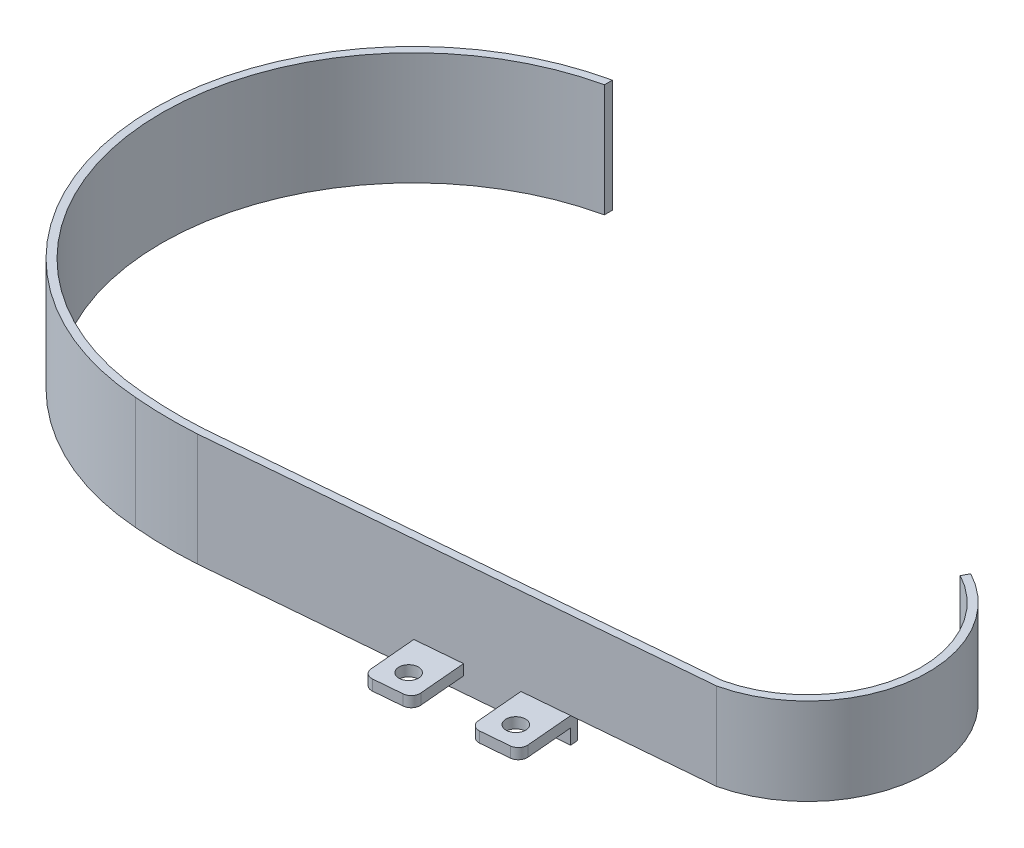
ISO-10303-21;
HEADER;
FILE_DESCRIPTION(('STEP AP214'),'2;1');
FILE_NAME('part.step','',(''),(''),'','','');
FILE_SCHEMA(('AUTOMOTIVE_DESIGN { 1 0 10303 214 1 1 1 1 }'));
ENDSEC;
DATA;
#1=APPLICATION_CONTEXT('core data for automotive mechanical design processes');
#2=APPLICATION_PROTOCOL_DEFINITION('international standard','automotive_design',2000,#1);
#3=PRODUCT_CONTEXT('',#1,'mechanical');
#4=PRODUCT('Part','Part','',(#3));
#5=PRODUCT_RELATED_PRODUCT_CATEGORY('part','',(#4));
#6=PRODUCT_DEFINITION_FORMATION('','',#4);
#7=PRODUCT_DEFINITION_CONTEXT('part definition',#1,'design');
#8=PRODUCT_DEFINITION('design','',#6,#7);
#9=PRODUCT_DEFINITION_SHAPE('','',#8);
#10=(LENGTH_UNIT() NAMED_UNIT(*) SI_UNIT(.MILLI.,.METRE.));
#11=(NAMED_UNIT(*) PLANE_ANGLE_UNIT() SI_UNIT($,.RADIAN.));
#12=(NAMED_UNIT(*) SI_UNIT($,.STERADIAN.) SOLID_ANGLE_UNIT());
#13=UNCERTAINTY_MEASURE_WITH_UNIT(LENGTH_MEASURE(1.E-05),#10,'distance_accuracy_value','');
#14=(GEOMETRIC_REPRESENTATION_CONTEXT(3) GLOBAL_UNCERTAINTY_ASSIGNED_CONTEXT((#13)) GLOBAL_UNIT_ASSIGNED_CONTEXT((#10,
#11,#12)) REPRESENTATION_CONTEXT('',''));
#15=CARTESIAN_POINT('',(0.,0.,0.));
#16=DIRECTION('',(0.,0.,1.));
#17=DIRECTION('',(1.,0.,0.));
#18=AXIS2_PLACEMENT_3D('',#15,#16,#17);
#19=CARTESIAN_POINT('',(187.443785094068,-22.3266,78.5446237632617));
#20=DIRECTION('',(-0.0861761294667495,0.,-0.996279917849462));
#21=DIRECTION('',(-0.996279917849462,0.,0.0861761294667495));
#22=AXIS2_PLACEMENT_3D('',#19,#20,#21);
#23=PLANE('',#22);
#24=DIRECTION('',(-0.996279917849461,0.,0.08617612946675));
#25=VECTOR('',#24,1.);
#26=CARTESIAN_POINT('',(139.197010709315,-13.1068000000013,82.7178688535654));
#27=LINE('',#26,#25);
#28=CARTESIAN_POINT('',(139.197010709315,-13.1068000000013,82.7178688535654));
#29=VERTEX_POINT('',#28);
#30=CARTESIAN_POINT('',(122.748429265621,-13.1068000000013,84.1406367510614));
#31=VERTEX_POINT('',#30);
#32=EDGE_CURVE('E236',#29,#31,#27,.T.);
#33=ORIENTED_EDGE('',*,*,#32,.F.);
#34=DIRECTION('',(0.996279917849462,0.,-0.0861761294667496));
#35=VECTOR('',#34,1.);
#36=CARTESIAN_POINT('',(8.1355101733642,-13.1068000000013,94.0544145732386));
#37=LINE('',#36,#35);
#38=CARTESIAN_POINT('',(187.443785094068,-13.1068000000013,78.5446237632617));
#39=VERTEX_POINT('',#38);
#40=EDGE_CURVE('E259',#29,#39,#37,.T.);
#41=ORIENTED_EDGE('',*,*,#40,.T.);
#42=DIRECTION('',(0.,1.,0.));
#43=VECTOR('',#42,1.);
#44=CARTESIAN_POINT('',(187.443785094068,-22.3266,78.5446237632617));
#45=LINE('',#44,#43);
#46=CARTESIAN_POINT('',(187.443785094068,18.161,78.5446237632617));
#47=VERTEX_POINT('',#46);
#48=EDGE_CURVE('E336',#39,#47,#45,.T.);
#49=ORIENTED_EDGE('',*,*,#48,.T.);
#50=DIRECTION('',(-0.996279917849462,0.,0.0861761294667495));
#51=VECTOR('',#50,1.);
#52=CARTESIAN_POINT('',(187.443785094068,18.161,78.5446237632617));
#53=LINE('',#52,#51);
#54=CARTESIAN_POINT('',(15.7338938107949,18.161,93.3971702783915));
#55=VERTEX_POINT('',#54);
#56=EDGE_CURVE('E299',#47,#55,#53,.T.);
#57=ORIENTED_EDGE('',*,*,#56,.T.);
#58=DIRECTION('',(0.,1.,0.));
#59=VECTOR('',#58,1.);
#60=CARTESIAN_POINT('',(15.7338938107949,-22.3266,93.3971702783915));
#61=LINE('',#60,#59);
#62=CARTESIAN_POINT('',(15.7338938107949,-22.3266,93.3971702783915));
#63=VERTEX_POINT('',#62);
#64=EDGE_CURVE('E338',#63,#55,#61,.T.);
#65=ORIENTED_EDGE('',*,*,#64,.F.);
#66=DIRECTION('',(-0.996279917849462,0.,0.0861761294667495));
#67=VECTOR('',#66,1.);
#68=CARTESIAN_POINT('',(187.443785094068,-22.3266,78.5446237632617));
#69=LINE('',#68,#67);
#70=CARTESIAN_POINT('',(139.197010709315,-22.3266,82.7178688535654));
#71=VERTEX_POINT('',#70);
#72=EDGE_CURVE('E326',#71,#63,#69,.T.);
#73=ORIENTED_EDGE('',*,*,#72,.F.);
#74=DIRECTION('',(0.,1.,0.));
#75=VECTOR('',#74,1.);
#76=CARTESIAN_POINT('',(139.197010709315,0.,82.7178688535654));
#77=LINE('',#76,#75);
#78=CARTESIAN_POINT('',(139.197010709315,-16.9168000000013,82.7178688535654));
#79=VERTEX_POINT('',#78);
#80=EDGE_CURVE('E262',#71,#79,#77,.T.);
#81=ORIENTED_EDGE('',*,*,#80,.T.);
#82=DIRECTION('',(0.996279917849461,0.,-0.08617612946675));
#83=VECTOR('',#82,1.);
#84=CARTESIAN_POINT('',(139.197010709315,-16.9168000000013,82.7178688535654));
#85=LINE('',#84,#83);
#86=CARTESIAN_POINT('',(122.748429265621,-16.9168000000013,84.1406367510614));
#87=VERTEX_POINT('',#86);
#88=EDGE_CURVE('E241',#87,#79,#85,.T.);
#89=ORIENTED_EDGE('',*,*,#88,.F.);
#90=DIRECTION('',(0.,-1.,0.));
#91=VECTOR('',#90,1.);
#92=CARTESIAN_POINT('',(122.748429265621,-13.1068000000013,84.1406367510615));
#93=LINE('',#92,#91);
#94=EDGE_CURVE('E247',#31,#87,#93,.T.);
#95=ORIENTED_EDGE('',*,*,#94,.F.);
#96=EDGE_LOOP('',(#33,#41,#49,#57,#65,#73,#81,#89,#95));
#97=FACE_BOUND('',#96,.T.);
#98=DIRECTION('',(0.,1.,0.));
#99=VECTOR('',#98,1.);
#100=CARTESIAN_POINT('',(103.769296830589,-13.1068000000013,85.7822920174031));
#101=LINE('',#100,#99);
#102=CARTESIAN_POINT('',(103.769296830589,-16.9168000000013,85.7822920174031));
#103=VERTEX_POINT('',#102);
#104=CARTESIAN_POINT('',(103.769296830588,-13.1068000000013,85.7822920174031));
#105=VERTEX_POINT('',#104);
#106=EDGE_CURVE('E201',#103,#105,#101,.T.);
#107=ORIENTED_EDGE('',*,*,#106,.F.);
#108=DIRECTION('',(0.996279917849462,0.,-0.0861761294667491));
#109=VECTOR('',#108,1.);
#110=CARTESIAN_POINT('',(103.769296830589,-16.9168000000013,85.7822920174031));
#111=LINE('',#110,#109);
#112=CARTESIAN_POINT('',(87.3207153868939,-16.9168000000013,87.2050599148991));
#113=VERTEX_POINT('',#112);
#114=EDGE_CURVE('E214',#113,#103,#111,.T.);
#115=ORIENTED_EDGE('',*,*,#114,.F.);
#116=DIRECTION('',(0.,-1.,0.));
#117=VECTOR('',#116,1.);
#118=CARTESIAN_POINT('',(87.3207153868939,-13.1068000000013,87.2050599148991));
#119=LINE('',#118,#117);
#120=CARTESIAN_POINT('',(87.3207153868939,-13.1068000000013,87.2050599148991));
#121=VERTEX_POINT('',#120);
#122=EDGE_CURVE('E224',#121,#113,#119,.T.);
#123=ORIENTED_EDGE('',*,*,#122,.F.);
#124=DIRECTION('',(-0.996279917849462,0.,0.0861761294667491));
#125=VECTOR('',#124,1.);
#126=CARTESIAN_POINT('',(103.769296830589,-13.1068000000013,85.7822920174031));
#127=LINE('',#126,#125);
#128=EDGE_CURVE('E217',#105,#121,#127,.T.);
#129=ORIENTED_EDGE('',*,*,#128,.F.);
#130=EDGE_LOOP('',(#107,#115,#123,#129));
#131=FACE_BOUND('',#130,.T.);
#132=ADVANCED_FACE('F37',(#97,#131),#23,.F.);
#133=CARTESIAN_POINT('',(186.839155598698,-22.3266,75.8167889277195));
#134=DIRECTION('',(-0.086176129466749,0.,-0.996279917849462));
#135=DIRECTION('',(-0.996279917849462,0.,0.086176129466749));
#136=AXIS2_PLACEMENT_3D('',#133,#134,#135);
#137=PLANE('',#136);
#138=DIRECTION('',(0.,1.,0.));
#139=VECTOR('',#138,1.);
#140=CARTESIAN_POINT('',(186.839155598698,-22.3266,75.8167889277195));
#141=LINE('',#140,#139);
#142=CARTESIAN_POINT('',(186.839155598698,-13.1068000000013,75.8167889277195));
#143=VERTEX_POINT('',#142);
#144=CARTESIAN_POINT('',(186.839155598698,18.161,75.8167889277195));
#145=VERTEX_POINT('',#144);
#146=EDGE_CURVE('E329',#143,#145,#141,.T.);
#147=ORIENTED_EDGE('',*,*,#146,.F.);
#148=DIRECTION('',(-0.996279917849462,0.,0.086176129466749));
#149=VECTOR('',#148,1.);
#150=CARTESIAN_POINT('',(186.839155598698,-13.1068000000013,75.8167889277195));
#151=LINE('',#150,#149);
#152=CARTESIAN_POINT('',(138.958320781565,-13.1068000000013,79.9583810106794));
#153=VERTEX_POINT('',#152);
#154=EDGE_CURVE('E278',#143,#153,#151,.T.);
#155=ORIENTED_EDGE('',*,*,#154,.T.);
#156=DIRECTION('',(0.,-1.,0.));
#157=VECTOR('',#156,1.);
#158=CARTESIAN_POINT('',(138.958320781565,-22.3266,79.9583810106794));
#159=LINE('',#158,#157);
#160=CARTESIAN_POINT('',(138.958320781565,-22.3266,79.9583810106794));
#161=VERTEX_POINT('',#160);
#162=EDGE_CURVE('E268',#153,#161,#159,.T.);
#163=ORIENTED_EDGE('',*,*,#162,.T.);
#164=DIRECTION('',(-0.996279917849462,0.,0.086176129466749));
#165=VECTOR('',#164,1.);
#166=CARTESIAN_POINT('',(186.839155598698,-22.3266,75.8167889277195));
#167=LINE('',#166,#165);
#168=CARTESIAN_POINT('',(15.7338938107949,-22.3266,90.6170362559049));
#169=VERTEX_POINT('',#168);
#170=EDGE_CURVE('E311',#161,#169,#167,.T.);
#171=ORIENTED_EDGE('',*,*,#170,.T.);
#172=DIRECTION('',(0.,1.,0.));
#173=VECTOR('',#172,1.);
#174=CARTESIAN_POINT('',(15.7338938107949,-22.3266,90.6170362559049));
#175=LINE('',#174,#173);
#176=CARTESIAN_POINT('',(15.7338938107949,18.161,90.6170362559049));
#177=VERTEX_POINT('',#176);
#178=EDGE_CURVE('E328',#169,#177,#175,.T.);
#179=ORIENTED_EDGE('',*,*,#178,.T.);
#180=DIRECTION('',(-0.996279917849462,0.,0.086176129466749));
#181=VECTOR('',#180,1.);
#182=CARTESIAN_POINT('',(186.839155598698,18.161,75.8167889277195));
#183=LINE('',#182,#181);
#184=EDGE_CURVE('E281',#145,#177,#183,.T.);
#185=ORIENTED_EDGE('',*,*,#184,.F.);
#186=EDGE_LOOP('',(#147,#155,#163,#171,#179,#185));
#187=FACE_BOUND('',#186,.T.);
#188=ADVANCED_FACE('F419',(#187),#137,.T.);
#189=CARTESIAN_POINT('',(177.83940901703,-22.3266,36.2514462962333));
#190=DIRECTION('',(0.,1.,0.));
#191=DIRECTION('',(0.,0.,1.));
#192=AXIS2_PLACEMENT_3D('',#189,#190,#191);
#193=CYLINDRICAL_SURFACE('',#192,40.576000001);
#194=CARTESIAN_POINT('',(177.83940901703,-13.1068000000013,36.2514462962333));
#195=DIRECTION('',(0.,-1.,0.));
#196=DIRECTION('',(1.,0.,0.));
#197=AXIS2_PLACEMENT_3D('',#194,#195,#196);
#198=CIRCLE('',#197,40.576000001);
#199=CARTESIAN_POINT('',(196.88940901703,-13.1068000000013,0.425348600822044));
#200=VERTEX_POINT('',#199);
#201=EDGE_CURVE('E276',#143,#200,#198,.F.);
#202=ORIENTED_EDGE('',*,*,#201,.F.);
#203=ORIENTED_EDGE('',*,*,#146,.T.);
#204=CARTESIAN_POINT('',(177.83940901703,18.161,36.2514462962333));
#205=DIRECTION('',(0.,1.,0.));
#206=DIRECTION('',(0.,0.,1.));
#207=AXIS2_PLACEMENT_3D('',#204,#205,#206);
#208=CIRCLE('',#207,40.576000001);
#209=CARTESIAN_POINT('',(196.88940901703,18.161,0.425348600822044));
#210=VERTEX_POINT('',#209);
#211=EDGE_CURVE('E308',#145,#210,#208,.T.);
#212=ORIENTED_EDGE('',*,*,#211,.T.);
#213=DIRECTION('',(0.,1.,0.));
#214=VECTOR('',#213,1.);
#215=CARTESIAN_POINT('',(196.88940901703,-22.3266,0.425348600822044));
#216=LINE('',#215,#214);
#217=EDGE_CURVE('E332',#200,#210,#216,.T.);
#218=ORIENTED_EDGE('',*,*,#217,.F.);
#219=EDGE_LOOP('',(#202,#203,#212,#218));
#220=FACE_BOUND('',#219,.T.);
#221=ADVANCED_FACE('F427',(#220),#193,.F.);
#222=CARTESIAN_POINT('',(196.88940901703,-22.3266,0.425348600822051));
#223=DIRECTION('',(0.882938133244488,0.,0.469489353300732));
#224=DIRECTION('',(0.469489353300732,0.,-0.882938133244488));
#225=AXIS2_PLACEMENT_3D('',#222,#223,#224);
#226=PLANE('',#225);
#227=DIRECTION('',(0.469489353300732,0.,-0.882938133244488));
#228=VECTOR('',#227,1.);
#229=CARTESIAN_POINT('',(196.88940901703,-13.1068000000013,0.425348600822051));
#230=LINE('',#229,#228);
#231=CARTESIAN_POINT('',(198.201162270152,-13.1068000000013,-2.04158054346305));
#232=VERTEX_POINT('',#231);
#233=EDGE_CURVE('E274',#200,#232,#230,.T.);
#234=ORIENTED_EDGE('',*,*,#233,.F.);
#235=ORIENTED_EDGE('',*,*,#217,.T.);
#236=DIRECTION('',(0.469489353300732,0.,-0.882938133244488));
#237=VECTOR('',#236,1.);
#238=CARTESIAN_POINT('',(196.88940901703,18.161,0.425348600822051));
#239=LINE('',#238,#237);
#240=CARTESIAN_POINT('',(198.201162270152,18.161,-2.04158054346305));
#241=VERTEX_POINT('',#240);
#242=EDGE_CURVE('E305',#210,#241,#239,.T.);
#243=ORIENTED_EDGE('',*,*,#242,.T.);
#244=DIRECTION('',(0.,1.,0.));
#245=VECTOR('',#244,1.);
#246=CARTESIAN_POINT('',(198.201162270152,-22.3266,-2.04158054346305));
#247=LINE('',#246,#245);
#248=EDGE_CURVE('E334',#232,#241,#247,.T.);
#249=ORIENTED_EDGE('',*,*,#248,.F.);
#250=EDGE_LOOP('',(#234,#235,#243,#249));
#251=FACE_BOUND('',#250,.T.);
#252=ADVANCED_FACE('F510',(#251),#226,.F.);
#253=CARTESIAN_POINT('',(177.83940901703,-22.3266,36.2514462962333));
#254=DIRECTION('',(0.,1.,0.));
#255=DIRECTION('',(0.,0.,1.));
#256=AXIS2_PLACEMENT_3D('',#253,#254,#255);
#257=CYLINDRICAL_SURFACE('',#256,43.370000001);
#258=ORIENTED_EDGE('',*,*,#48,.F.);
#259=CARTESIAN_POINT('',(177.83940901703,-13.1068000000013,36.2514462962333));
#260=DIRECTION('',(0.,-1.,0.));
#261=DIRECTION('',(1.,0.,0.));
#262=AXIS2_PLACEMENT_3D('',#259,#260,#261);
#263=CIRCLE('',#262,43.370000001);
#264=EDGE_CURVE('E271',#39,#232,#263,.F.);
#265=ORIENTED_EDGE('',*,*,#264,.T.);
#266=ORIENTED_EDGE('',*,*,#248,.T.);
#267=CARTESIAN_POINT('',(177.83940901703,18.161,36.2514462962333));
#268=DIRECTION('',(0.,1.,0.));
#269=DIRECTION('',(0.,0.,1.));
#270=AXIS2_PLACEMENT_3D('',#267,#268,#269);
#271=CIRCLE('',#270,43.370000001);
#272=EDGE_CURVE('E302',#47,#241,#271,.T.);
#273=ORIENTED_EDGE('',*,*,#272,.F.);
#274=EDGE_LOOP('',(#258,#265,#266,#273));
#275=FACE_BOUND('',#274,.T.);
#276=ADVANCED_FACE('F433',(#275),#257,.T.);
#277=CARTESIAN_POINT('',(6.27111389551688,-22.3266,-54.9196805978472));
#278=DIRECTION('',(0.,-1.,0.));
#279=DIRECTION('',(0.,0.,-1.));
#280=AXIS2_PLACEMENT_3D('',#277,#278,#279);
#281=PLANE('',#280);
#282=ORIENTED_EDGE('',*,*,#170,.F.);
#283=DIRECTION('',(0.0861761294667495,0.,0.996279917849462));
#284=VECTOR('',#283,1.);
#285=CARTESIAN_POINT('',(126.392912638676,-22.3266,-65.3099649896213));
#286=LINE('',#285,#284);
#287=EDGE_CURVE('E331',#161,#71,#286,.T.);
#288=ORIENTED_EDGE('',*,*,#287,.T.);
#289=ORIENTED_EDGE('',*,*,#72,.T.);
#290=CARTESIAN_POINT('',(6.13171110214794,-22.3266,-52.130415572278));
#291=DIRECTION('',(0.,-1.,0.));
#292=DIRECTION('',(0.,0.,-1.));
#293=AXIS2_PLACEMENT_3D('',#290,#291,#292);
#294=CIRCLE('',#293,145.844026810474);
#295=CARTESIAN_POINT('',(-6.85731477600897,-22.3266,93.1340513941167));
#296=VERTEX_POINT('',#295);
#297=EDGE_CURVE('E324',#63,#296,#294,.T.);
#298=ORIENTED_EDGE('',*,*,#297,.T.);
#299=CARTESIAN_POINT('',(5.51642065360625E-13,-22.3266,0.));
#300=DIRECTION('',(0.,-1.,0.));
#301=DIRECTION('',(0.,0.,-1.));
#302=AXIS2_PLACEMENT_3D('',#299,#300,#301);
#303=CIRCLE('',#302,93.3861568703801);
#304=CARTESIAN_POINT('',(-19.791883622163,-22.3266,-91.2647557258879));
#305=VERTEX_POINT('',#304);
#306=EDGE_CURVE('E322',#296,#305,#303,.T.);
#307=ORIENTED_EDGE('',*,*,#306,.T.);
#308=DIRECTION('',(0.,0.,-1.));
#309=VECTOR('',#308,1.);
#310=CARTESIAN_POINT('',(-19.7918836221629,-22.3266,-88.4037342486974));
#311=LINE('',#310,#309);
#312=CARTESIAN_POINT('',(-19.7918836221629,-22.3266,-88.4037342486974));
#313=VERTEX_POINT('',#312);
#314=EDGE_CURVE('E319',#313,#305,#311,.T.);
#315=ORIENTED_EDGE('',*,*,#314,.F.);
#316=CARTESIAN_POINT('',(0.,-22.3266,0.));
#317=DIRECTION('',(0.,-1.,0.));
#318=DIRECTION('',(0.,0.,-1.));
#319=AXIS2_PLACEMENT_3D('',#316,#317,#318);
#320=CIRCLE('',#319,90.5921568703801);
#321=CARTESIAN_POINT('',(-6.857314776009,-22.3266,90.3322540430066));
#322=VERTEX_POINT('',#321);
#323=EDGE_CURVE('E316',#322,#313,#320,.T.);
#324=ORIENTED_EDGE('',*,*,#323,.F.);
#325=CARTESIAN_POINT('',(6.27111389551688,-22.3266,-54.9196805978472));
#326=DIRECTION('',(0.,-1.,0.));
#327=DIRECTION('',(0.,0.,-1.));
#328=AXIS2_PLACEMENT_3D('',#325,#326,#327);
#329=CIRCLE('',#328,145.844026810474);
#330=EDGE_CURVE('E313',#169,#322,#329,.T.);
#331=ORIENTED_EDGE('',*,*,#330,.F.);
#332=EDGE_LOOP('',(#282,#288,#289,#298,#307,#315,#324,#331));
#333=FACE_BOUND('',#332,.T.);
#334=ADVANCED_FACE('F439',(#333),#281,.T.);
#335=CARTESIAN_POINT('',(6.13171110214794,-22.3266,-52.130415572278));
#336=DIRECTION('',(0.,1.,0.));
#337=DIRECTION('',(0.,0.,1.));
#338=AXIS2_PLACEMENT_3D('',#335,#336,#337);
#339=CYLINDRICAL_SURFACE('',#338,145.844026810474);
#340=ORIENTED_EDGE('',*,*,#64,.T.);
#341=CARTESIAN_POINT('',(6.13171110214794,18.161,-52.130415572278));
#342=DIRECTION('',(0.,-1.,0.));
#343=DIRECTION('',(0.,0.,-1.));
#344=AXIS2_PLACEMENT_3D('',#341,#342,#343);
#345=CIRCLE('',#344,145.844026810474);
#346=CARTESIAN_POINT('',(-6.85731477600897,18.161,93.1340513941167));
#347=VERTEX_POINT('',#346);
#348=EDGE_CURVE('E296',#55,#347,#345,.T.);
#349=ORIENTED_EDGE('',*,*,#348,.T.);
#350=DIRECTION('',(0.,1.,0.));
#351=VECTOR('',#350,1.);
#352=CARTESIAN_POINT('',(-6.85731477600897,-22.3266,93.1340513941167));
#353=LINE('',#352,#351);
#354=EDGE_CURVE('E340',#296,#347,#353,.T.);
#355=ORIENTED_EDGE('',*,*,#354,.F.);
#356=ORIENTED_EDGE('',*,*,#297,.F.);
#357=EDGE_LOOP('',(#340,#349,#355,#356));
#358=FACE_BOUND('',#357,.T.);
#359=ADVANCED_FACE('F435',(#358),#339,.T.);
#360=CARTESIAN_POINT('',(5.51642065360625E-13,-22.3266,0.));
#361=DIRECTION('',(0.,1.,0.));
#362=DIRECTION('',(0.,0.,1.));
#363=AXIS2_PLACEMENT_3D('',#360,#361,#362);
#364=CYLINDRICAL_SURFACE('',#363,93.3861568703801);
#365=ORIENTED_EDGE('',*,*,#354,.T.);
#366=CARTESIAN_POINT('',(5.51642065360625E-13,18.161,0.));
#367=DIRECTION('',(0.,-1.,0.));
#368=DIRECTION('',(0.,0.,-1.));
#369=AXIS2_PLACEMENT_3D('',#366,#367,#368);
#370=CIRCLE('',#369,93.3861568703801);
#371=CARTESIAN_POINT('',(-19.791883622163,18.161,-91.2647557258879));
#372=VERTEX_POINT('',#371);
#373=EDGE_CURVE('E293',#347,#372,#370,.T.);
#374=ORIENTED_EDGE('',*,*,#373,.T.);
#375=DIRECTION('',(0.,1.,0.));
#376=VECTOR('',#375,1.);
#377=CARTESIAN_POINT('',(-19.791883622163,-22.3266,-91.2647557258879));
#378=LINE('',#377,#376);
#379=EDGE_CURVE('E342',#305,#372,#378,.T.);
#380=ORIENTED_EDGE('',*,*,#379,.F.);
#381=ORIENTED_EDGE('',*,*,#306,.F.);
#382=EDGE_LOOP('',(#365,#374,#380,#381));
#383=FACE_BOUND('',#382,.T.);
#384=ADVANCED_FACE('F438',(#383),#364,.T.);
#385=CARTESIAN_POINT('',(-19.7918836221629,-22.3266,-88.4037342486974));
#386=DIRECTION('',(1.,0.,0.));
#387=DIRECTION('',(0.,0.,-1.));
#388=AXIS2_PLACEMENT_3D('',#385,#386,#387);
#389=PLANE('',#388);
#390=ORIENTED_EDGE('',*,*,#379,.T.);
#391=DIRECTION('',(0.,0.,-1.));
#392=VECTOR('',#391,1.);
#393=CARTESIAN_POINT('',(-19.7918836221629,18.161,-88.4037342486974));
#394=LINE('',#393,#392);
#395=CARTESIAN_POINT('',(-19.7918836221629,18.161,-88.4037342486974));
#396=VERTEX_POINT('',#395);
#397=EDGE_CURVE('E290',#396,#372,#394,.T.);
#398=ORIENTED_EDGE('',*,*,#397,.F.);
#399=DIRECTION('',(0.,1.,0.));
#400=VECTOR('',#399,1.);
#401=CARTESIAN_POINT('',(-19.7918836221629,-22.3266,-88.4037342486974));
#402=LINE('',#401,#400);
#403=EDGE_CURVE('E344',#313,#396,#402,.T.);
#404=ORIENTED_EDGE('',*,*,#403,.F.);
#405=ORIENTED_EDGE('',*,*,#314,.T.);
#406=EDGE_LOOP('',(#390,#398,#404,#405));
#407=FACE_BOUND('',#406,.T.);
#408=ADVANCED_FACE('F443',(#407),#389,.T.);
#409=CARTESIAN_POINT('',(0.,-22.3266,0.));
#410=DIRECTION('',(0.,1.,0.));
#411=DIRECTION('',(0.,0.,1.));
#412=AXIS2_PLACEMENT_3D('',#409,#410,#411);
#413=CYLINDRICAL_SURFACE('',#412,90.5921568703801);
#414=ORIENTED_EDGE('',*,*,#403,.T.);
#415=CARTESIAN_POINT('',(0.,18.161,0.));
#416=DIRECTION('',(0.,-1.,0.));
#417=DIRECTION('',(0.,0.,-1.));
#418=AXIS2_PLACEMENT_3D('',#415,#416,#417);
#419=CIRCLE('',#418,90.5921568703801);
#420=CARTESIAN_POINT('',(-6.857314776009,18.161,90.3322540430066));
#421=VERTEX_POINT('',#420);
#422=EDGE_CURVE('E287',#421,#396,#419,.T.);
#423=ORIENTED_EDGE('',*,*,#422,.F.);
#424=DIRECTION('',(0.,1.,0.));
#425=VECTOR('',#424,1.);
#426=CARTESIAN_POINT('',(-6.857314776009,-22.3266,90.3322540430066));
#427=LINE('',#426,#425);
#428=EDGE_CURVE('E346',#322,#421,#427,.T.);
#429=ORIENTED_EDGE('',*,*,#428,.F.);
#430=ORIENTED_EDGE('',*,*,#323,.T.);
#431=EDGE_LOOP('',(#414,#423,#429,#430));
#432=FACE_BOUND('',#431,.T.);
#433=ADVANCED_FACE('F447',(#432),#413,.F.);
#434=CARTESIAN_POINT('',(6.27111389551688,-22.3266,-54.9196805978472));
#435=DIRECTION('',(0.,1.,0.));
#436=DIRECTION('',(0.,0.,1.));
#437=AXIS2_PLACEMENT_3D('',#434,#435,#436);
#438=CYLINDRICAL_SURFACE('',#437,145.844026810474);
#439=ORIENTED_EDGE('',*,*,#428,.T.);
#440=CARTESIAN_POINT('',(6.27111389551688,18.161,-54.9196805978472));
#441=DIRECTION('',(0.,-1.,0.));
#442=DIRECTION('',(0.,0.,-1.));
#443=AXIS2_PLACEMENT_3D('',#440,#441,#442);
#444=CIRCLE('',#443,145.844026810474);
#445=EDGE_CURVE('E284',#177,#421,#444,.T.);
#446=ORIENTED_EDGE('',*,*,#445,.F.);
#447=ORIENTED_EDGE('',*,*,#178,.F.);
#448=ORIENTED_EDGE('',*,*,#330,.T.);
#449=EDGE_LOOP('',(#439,#446,#447,#448));
#450=FACE_BOUND('',#449,.T.);
#451=ADVANCED_FACE('F451',(#450),#438,.F.);
#452=CARTESIAN_POINT('',(6.27111389551688,18.161,-54.9196805978472));
#453=DIRECTION('',(0.,-1.,0.));
#454=DIRECTION('',(0.,0.,-1.));
#455=AXIS2_PLACEMENT_3D('',#452,#453,#454);
#456=PLANE('',#455);
#457=ORIENTED_EDGE('',*,*,#184,.T.);
#458=ORIENTED_EDGE('',*,*,#445,.T.);
#459=ORIENTED_EDGE('',*,*,#422,.T.);
#460=ORIENTED_EDGE('',*,*,#397,.T.);
#461=ORIENTED_EDGE('',*,*,#373,.F.);
#462=ORIENTED_EDGE('',*,*,#348,.F.);
#463=ORIENTED_EDGE('',*,*,#56,.F.);
#464=ORIENTED_EDGE('',*,*,#272,.T.);
#465=ORIENTED_EDGE('',*,*,#242,.F.);
#466=ORIENTED_EDGE('',*,*,#211,.F.);
#467=EDGE_LOOP('',(#457,#458,#459,#460,#461,#462,#463,#464,#465,#466));
#468=FACE_BOUND('',#467,.T.);
#469=ADVANCED_FACE('F454',(#468),#456,.F.);
#470=CARTESIAN_POINT('',(-8.52910152010724,-13.1068000000013,-98.6047135600447));
#471=DIRECTION('',(0.,-1.,0.));
#472=DIRECTION('',(1.,0.,0.));
#473=AXIS2_PLACEMENT_3D('',#470,#471,#472);
#474=PLANE('',#473);
#475=ORIENTED_EDGE('',*,*,#201,.T.);
#476=ORIENTED_EDGE('',*,*,#233,.T.);
#477=ORIENTED_EDGE('',*,*,#264,.F.);
#478=ORIENTED_EDGE('',*,*,#40,.F.);
#479=DIRECTION('',(0.0861761294667495,0.,0.996279917849462));
#480=VECTOR('',#479,1.);
#481=CARTESIAN_POINT('',(122.532399015844,-13.1068000000013,-109.941259279718));
#482=LINE('',#481,#480);
#483=EDGE_CURVE('E265',#153,#29,#482,.T.);
#484=ORIENTED_EDGE('',*,*,#483,.F.);
#485=ORIENTED_EDGE('',*,*,#154,.F.);
#486=EDGE_LOOP('',(#475,#476,#477,#478,#484,#485));
#487=FACE_BOUND('',#486,.T.);
#488=ADVANCED_FACE('F506',(#487),#474,.T.);
#489=CARTESIAN_POINT('',(122.532399015844,0.,-109.941259279718));
#490=DIRECTION('',(0.996279917849462,0.,-0.0861761294667495));
#491=DIRECTION('',(-0.0861761294667495,0.,-0.996279917849462));
#492=AXIS2_PLACEMENT_3D('',#489,#490,#491);
#493=PLANE('',#492);
#494=DIRECTION('',(-0.0861761294667495,0.,-0.996279917849462));
#495=VECTOR('',#494,1.);
#496=CARTESIAN_POINT('',(140.926220923195,-13.1068000000013,102.709221685133));
#497=LINE('',#496,#495);
#498=CARTESIAN_POINT('',(140.652611712138,-13.1068000000013,99.5460329459607));
#499=VERTEX_POINT('',#498);
#500=EDGE_CURVE('E257',#499,#29,#497,.T.);
#501=ORIENTED_EDGE('',*,*,#500,.F.);
#502=DIRECTION('',(0.,1.,0.));
#503=VECTOR('',#502,1.);
#504=CARTESIAN_POINT('',(140.652611712138,-16.9168000000013,99.5460329459607));
#505=LINE('',#504,#503);
#506=CARTESIAN_POINT('',(140.652611712138,-16.9168000000013,99.5460329459607));
#507=VERTEX_POINT('',#506);
#508=EDGE_CURVE('E62',#499,#507,#505,.F.);
#509=ORIENTED_EDGE('',*,*,#508,.T.);
#510=DIRECTION('',(-0.0861761294667495,0.,-0.996279917849462));
#511=VECTOR('',#510,1.);
#512=CARTESIAN_POINT('',(140.926220923195,-16.9168000000013,102.709221685133));
#513=LINE('',#512,#511);
#514=EDGE_CURVE('E244',#507,#79,#513,.T.);
#515=ORIENTED_EDGE('',*,*,#514,.T.);
#516=ORIENTED_EDGE('',*,*,#80,.F.);
#517=ORIENTED_EDGE('',*,*,#287,.F.);
#518=ORIENTED_EDGE('',*,*,#162,.F.);
#519=ORIENTED_EDGE('',*,*,#483,.T.);
#520=EDGE_LOOP('',(#501,#509,#515,#516,#517,#518,#519));
#521=FACE_BOUND('',#520,.T.);
#522=ADVANCED_FACE('F488',(#521),#493,.T.);
#523=CARTESIAN_POINT('',(140.926220923195,-13.1068000000013,102.709221685133));
#524=DIRECTION('',(0.,-1.,0.));
#525=DIRECTION('',(0.,0.,-1.));
#526=AXIS2_PLACEMENT_3D('',#523,#524,#525);
#527=PLANE('',#526);
#528=CARTESIAN_POINT('',(132.13436634208,-13.1068000000013,95.3852891330088));
#529=DIRECTION('',(0.,-1.,0.));
#530=DIRECTION('',(0.,0.,-1.));
#531=AXIS2_PLACEMENT_3D('',#528,#529,#530);
#532=CIRCLE('',#531,3.50000000000002);
#533=CARTESIAN_POINT('',(132.13436634208,-13.1068000000013,91.8852891330088));
#534=VERTEX_POINT('',#533);
#535=EDGE_CURVE('E218',#534,#534,#532,.T.);
#536=ORIENTED_EDGE('',*,*,#535,.T.);
#537=EDGE_LOOP('',(#536));
#538=FACE_BOUND('',#537,.T.);
#539=DIRECTION('',(-0.996279917849461,0.,0.08617612946675));
#540=VECTOR('',#539,1.);
#541=CARTESIAN_POINT('',(140.926220923195,-13.1068000000013,102.709221685133));
#542=LINE('',#541,#540);
#543=CARTESIAN_POINT('',(137.763032184023,-13.1068000000013,102.98283089619));
#544=VERTEX_POINT('',#543);
#545=CARTESIAN_POINT('',(127.640828218673,-13.1068000000013,103.858380371572));
#546=VERTEX_POINT('',#545);
#547=EDGE_CURVE('E237',#544,#546,#542,.T.);
#548=ORIENTED_EDGE('',*,*,#547,.F.);
#549=CARTESIAN_POINT('',(137.489422972966,-13.1068000000013,99.8196421570177));
#550=DIRECTION('',(0.,-1.,0.));
#551=DIRECTION('',(0.,0.,-1.));
#552=AXIS2_PLACEMENT_3D('',#549,#550,#551);
#553=CIRCLE('',#552,3.175);
#554=EDGE_CURVE('E376',#544,#499,#553,.F.);
#555=ORIENTED_EDGE('',*,*,#554,.T.);
#556=ORIENTED_EDGE('',*,*,#500,.T.);
#557=ORIENTED_EDGE('',*,*,#32,.T.);
#558=DIRECTION('',(-0.0861761294667495,0.,-0.996279917849462));
#559=VECTOR('',#558,1.);
#560=CARTESIAN_POINT('',(124.477639479501,-13.1068000000013,104.131989582629));
#561=LINE('',#560,#559);
#562=CARTESIAN_POINT('',(124.204030268444,-13.1068000000013,100.968800843457));
#563=VERTEX_POINT('',#562);
#564=EDGE_CURVE('E255',#563,#31,#561,.T.);
#565=ORIENTED_EDGE('',*,*,#564,.F.);
#566=CARTESIAN_POINT('',(127.367219007616,-13.1068000000013,100.6951916324));
#567=DIRECTION('',(0.,-1.,0.));
#568=DIRECTION('',(0.,0.,-1.));
#569=AXIS2_PLACEMENT_3D('',#566,#567,#568);
#570=CIRCLE('',#569,3.175);
#571=EDGE_CURVE('E374',#563,#546,#570,.F.);
#572=ORIENTED_EDGE('',*,*,#571,.T.);
#573=EDGE_LOOP('',(#548,#555,#556,#557,#565,#572));
#574=FACE_BOUND('',#573,.T.);
#575=ADVANCED_FACE('F482',(#538,#574),#527,.F.);
#576=CARTESIAN_POINT('',(124.477639479501,-13.1068000000013,104.131989582629));
#577=DIRECTION('',(0.996279917849462,0.,-0.0861761294667495));
#578=DIRECTION('',(-0.0861761294667495,0.,-0.996279917849462));
#579=AXIS2_PLACEMENT_3D('',#576,#577,#578);
#580=PLANE('',#579);
#581=DIRECTION('',(-0.0861761294667495,0.,-0.996279917849462));
#582=VECTOR('',#581,1.);
#583=CARTESIAN_POINT('',(124.477639479501,-16.9168000000013,104.131989582629));
#584=LINE('',#583,#582);
#585=CARTESIAN_POINT('',(124.204030268444,-16.9168000000013,100.968800843457));
#586=VERTEX_POINT('',#585);
#587=EDGE_CURVE('E253',#586,#87,#584,.T.);
#588=ORIENTED_EDGE('',*,*,#587,.F.);
#589=DIRECTION('',(0.,-1.,0.));
#590=VECTOR('',#589,1.);
#591=CARTESIAN_POINT('',(124.204030268444,-13.1068000000013,100.968800843457));
#592=LINE('',#591,#590);
#593=EDGE_CURVE('E11',#586,#563,#592,.F.);
#594=ORIENTED_EDGE('',*,*,#593,.T.);
#595=ORIENTED_EDGE('',*,*,#564,.T.);
#596=ORIENTED_EDGE('',*,*,#94,.T.);
#597=EDGE_LOOP('',(#588,#594,#595,#596));
#598=FACE_BOUND('',#597,.T.);
#599=ADVANCED_FACE('F479',(#598),#580,.F.);
#600=CARTESIAN_POINT('',(140.926220923195,-16.9168000000013,102.709221685133));
#601=DIRECTION('',(0.,1.,0.));
#602=DIRECTION('',(-1.,0.,0.));
#603=AXIS2_PLACEMENT_3D('',#600,#601,#602);
#604=PLANE('',#603);
#605=CARTESIAN_POINT('',(132.13436634208,-16.9168000000013,95.3852891330088));
#606=DIRECTION('',(0.,1.,0.));
#607=DIRECTION('',(-1.,0.,0.));
#608=AXIS2_PLACEMENT_3D('',#605,#606,#607);
#609=CIRCLE('',#608,3.50000000000002);
#610=CARTESIAN_POINT('',(128.63436634208,-16.9168000000013,95.3852891330088));
#611=VERTEX_POINT('',#610);
#612=EDGE_CURVE('E41',#611,#611,#609,.T.);
#613=ORIENTED_EDGE('',*,*,#612,.T.);
#614=EDGE_LOOP('',(#613));
#615=FACE_BOUND('',#614,.T.);
#616=ORIENTED_EDGE('',*,*,#514,.F.);
#617=CARTESIAN_POINT('',(137.489422972966,-16.9168000000013,99.8196421570177));
#618=DIRECTION('',(0.,1.,0.));
#619=DIRECTION('',(-1.,0.,0.));
#620=AXIS2_PLACEMENT_3D('',#617,#618,#619);
#621=CIRCLE('',#620,3.175);
#622=CARTESIAN_POINT('',(137.763032184023,-16.9168000000013,102.98283089619));
#623=VERTEX_POINT('',#622);
#624=EDGE_CURVE('E46',#507,#623,#621,.F.);
#625=ORIENTED_EDGE('',*,*,#624,.T.);
#626=DIRECTION('',(0.996279917849461,0.,-0.08617612946675));
#627=VECTOR('',#626,1.);
#628=CARTESIAN_POINT('',(140.926220923195,-16.9168000000013,102.709221685133));
#629=LINE('',#628,#627);
#630=CARTESIAN_POINT('',(127.640828218673,-16.9168000000013,103.858380371572));
#631=VERTEX_POINT('',#630);
#632=EDGE_CURVE('E240',#631,#623,#629,.T.);
#633=ORIENTED_EDGE('',*,*,#632,.F.);
#634=CARTESIAN_POINT('',(127.367219007616,-16.9168000000013,100.6951916324));
#635=DIRECTION('',(0.,1.,0.));
#636=DIRECTION('',(-1.,0.,0.));
#637=AXIS2_PLACEMENT_3D('',#634,#635,#636);
#638=CIRCLE('',#637,3.175);
#639=EDGE_CURVE('E54',#631,#586,#638,.F.);
#640=ORIENTED_EDGE('',*,*,#639,.T.);
#641=ORIENTED_EDGE('',*,*,#587,.T.);
#642=ORIENTED_EDGE('',*,*,#88,.T.);
#643=EDGE_LOOP('',(#616,#625,#633,#640,#641,#642));
#644=FACE_BOUND('',#643,.T.);
#645=ADVANCED_FACE('F470',(#615,#644),#604,.F.);
#646=CARTESIAN_POINT('',(9.86472038724404,0.,114.045767404806));
#647=DIRECTION('',(-0.08617612946675,0.,-0.996279917849462));
#648=DIRECTION('',(-0.996279917849462,0.,0.08617612946675));
#649=AXIS2_PLACEMENT_3D('',#646,#647,#648);
#650=PLANE('',#649);
#651=ORIENTED_EDGE('',*,*,#632,.T.);
#652=DIRECTION('',(0.,1.,0.));
#653=VECTOR('',#652,1.);
#654=CARTESIAN_POINT('',(137.763032184023,-13.1068000000013,102.98283089619));
#655=LINE('',#654,#653);
#656=EDGE_CURVE('E371',#623,#544,#655,.T.);
#657=ORIENTED_EDGE('',*,*,#656,.T.);
#658=ORIENTED_EDGE('',*,*,#547,.T.);
#659=DIRECTION('',(0.,-1.,0.));
#660=VECTOR('',#659,1.);
#661=CARTESIAN_POINT('',(127.640828218673,0.,103.858380371572));
#662=LINE('',#661,#660);
#663=EDGE_CURVE('E368',#546,#631,#662,.T.);
#664=ORIENTED_EDGE('',*,*,#663,.T.);
#665=EDGE_LOOP('',(#651,#657,#658,#664));
#666=FACE_BOUND('',#665,.T.);
#667=ADVANCED_FACE('F472',(#666),#650,.F.);
#668=CARTESIAN_POINT('',(105.498507044468,-13.1068000000013,105.77364484897));
#669=DIRECTION('',(-0.996279917849462,0.,0.0861761294667495));
#670=DIRECTION('',(0.0861761294667495,0.,0.996279917849462));
#671=AXIS2_PLACEMENT_3D('',#668,#669,#670);
#672=PLANE('',#671);
#673=DIRECTION('',(-0.0861761294667495,0.,-0.996279917849462));
#674=VECTOR('',#673,1.);
#675=CARTESIAN_POINT('',(105.498507044468,-13.1068000000013,105.77364484897));
#676=LINE('',#675,#674);
#677=CARTESIAN_POINT('',(105.224897833411,-13.1068000000013,102.610456109798));
#678=VERTEX_POINT('',#677);
#679=EDGE_CURVE('E234',#678,#105,#676,.T.);
#680=ORIENTED_EDGE('',*,*,#679,.F.);
#681=DIRECTION('',(0.,1.,0.));
#682=VECTOR('',#681,1.);
#683=CARTESIAN_POINT('',(105.224897833411,-13.1068000000013,102.610456109798));
#684=LINE('',#683,#682);
#685=CARTESIAN_POINT('',(105.224897833411,-16.9168000000013,102.610456109798));
#686=VERTEX_POINT('',#685);
#687=EDGE_CURVE('E203',#678,#686,#684,.F.);
#688=ORIENTED_EDGE('',*,*,#687,.T.);
#689=DIRECTION('',(-0.0861761294667495,0.,-0.996279917849462));
#690=VECTOR('',#689,1.);
#691=CARTESIAN_POINT('',(105.498507044468,-16.9168000000013,105.77364484897));
#692=LINE('',#691,#690);
#693=EDGE_CURVE('E197',#686,#103,#692,.T.);
#694=ORIENTED_EDGE('',*,*,#693,.T.);
#695=ORIENTED_EDGE('',*,*,#106,.T.);
#696=EDGE_LOOP('',(#680,#688,#694,#695));
#697=FACE_BOUND('',#696,.T.);
#698=ADVANCED_FACE('F200',(#697),#672,.F.);
#699=CARTESIAN_POINT('',(105.498507044468,-13.1068000000013,105.77364484897));
#700=DIRECTION('',(0.,-1.,0.));
#701=DIRECTION('',(0.,0.,-1.));
#702=AXIS2_PLACEMENT_3D('',#699,#700,#701);
#703=PLANE('',#702);
#704=CARTESIAN_POINT('',(96.7066524633533,-13.1068000000013,98.4497122968464));
#705=DIRECTION('',(0.,-1.,0.));
#706=DIRECTION('',(0.,0.,-1.));
#707=AXIS2_PLACEMENT_3D('',#704,#705,#706);
#708=CIRCLE('',#707,3.49999999999999);
#709=CARTESIAN_POINT('',(96.7066524633533,-13.1068000000013,94.9497122968464));
#710=VERTEX_POINT('',#709);
#711=EDGE_CURVE('E382',#710,#710,#708,.T.);
#712=ORIENTED_EDGE('',*,*,#711,.T.);
#713=EDGE_LOOP('',(#712));
#714=FACE_BOUND('',#713,.T.);
#715=DIRECTION('',(-0.0861761294667495,0.,-0.996279917849462));
#716=VECTOR('',#715,1.);
#717=CARTESIAN_POINT('',(89.0499256007737,-13.1068000000013,107.196412746466));
#718=LINE('',#717,#716);
#719=CARTESIAN_POINT('',(88.7763163897168,-13.1068000000013,104.033224007294));
#720=VERTEX_POINT('',#719);
#721=EDGE_CURVE('E232',#720,#121,#718,.T.);
#722=ORIENTED_EDGE('',*,*,#721,.F.);
#723=CARTESIAN_POINT('',(91.9395051288888,-13.1068000000013,103.759614796237));
#724=DIRECTION('',(0.,-1.,0.));
#725=DIRECTION('',(0.,0.,-1.));
#726=AXIS2_PLACEMENT_3D('',#723,#724,#725);
#727=CIRCLE('',#726,3.175);
#728=CARTESIAN_POINT('',(92.2131143399457,-13.1068000000013,106.922803535409));
#729=VERTEX_POINT('',#728);
#730=EDGE_CURVE('E365',#720,#729,#727,.F.);
#731=ORIENTED_EDGE('',*,*,#730,.T.);
#732=DIRECTION('',(-0.996279917849462,0.,0.0861761294667491));
#733=VECTOR('',#732,1.);
#734=CARTESIAN_POINT('',(105.498507044468,-13.1068000000013,105.77364484897));
#735=LINE('',#734,#733);
#736=CARTESIAN_POINT('',(102.335318305296,-13.1068000000013,106.047254060027));
#737=VERTEX_POINT('',#736);
#738=EDGE_CURVE('E223',#737,#729,#735,.T.);
#739=ORIENTED_EDGE('',*,*,#738,.F.);
#740=CARTESIAN_POINT('',(102.061709094239,-13.1068000000013,102.884065320855));
#741=DIRECTION('',(0.,-1.,0.));
#742=DIRECTION('',(0.,0.,-1.));
#743=AXIS2_PLACEMENT_3D('',#740,#741,#742);
#744=CIRCLE('',#743,3.175);
#745=EDGE_CURVE('E363',#737,#678,#744,.F.);
#746=ORIENTED_EDGE('',*,*,#745,.T.);
#747=ORIENTED_EDGE('',*,*,#679,.T.);
#748=ORIENTED_EDGE('',*,*,#128,.T.);
#749=EDGE_LOOP('',(#722,#731,#739,#746,#747,#748));
#750=FACE_BOUND('',#749,.T.);
#751=ADVANCED_FACE('F396',(#714,#750),#703,.F.);
#752=CARTESIAN_POINT('',(89.0499256007737,-13.1068000000013,107.196412746466));
#753=DIRECTION('',(0.996279917849462,0.,-0.0861761294667495));
#754=DIRECTION('',(-0.0861761294667495,0.,-0.996279917849462));
#755=AXIS2_PLACEMENT_3D('',#752,#753,#754);
#756=PLANE('',#755);
#757=DIRECTION('',(-0.0861761294667495,0.,-0.996279917849462));
#758=VECTOR('',#757,1.);
#759=CARTESIAN_POINT('',(89.0499256007737,-16.9168000000013,107.196412746466));
#760=LINE('',#759,#758);
#761=CARTESIAN_POINT('',(88.7763163897168,-16.9168000000013,104.033224007294));
#762=VERTEX_POINT('',#761);
#763=EDGE_CURVE('E207',#762,#113,#760,.T.);
#764=ORIENTED_EDGE('',*,*,#763,.F.);
#765=DIRECTION('',(0.,-1.,0.));
#766=VECTOR('',#765,1.);
#767=CARTESIAN_POINT('',(88.7763163897168,-13.1068000000013,104.033224007294));
#768=LINE('',#767,#766);
#769=EDGE_CURVE('E361',#762,#720,#768,.F.);
#770=ORIENTED_EDGE('',*,*,#769,.T.);
#771=ORIENTED_EDGE('',*,*,#721,.T.);
#772=ORIENTED_EDGE('',*,*,#122,.T.);
#773=EDGE_LOOP('',(#764,#770,#771,#772));
#774=FACE_BOUND('',#773,.T.);
#775=ADVANCED_FACE('F409',(#774),#756,.F.);
#776=CARTESIAN_POINT('',(105.498507044468,-16.9168000000013,105.77364484897));
#777=DIRECTION('',(0.,1.,0.));
#778=DIRECTION('',(0.,0.,1.));
#779=AXIS2_PLACEMENT_3D('',#776,#777,#778);
#780=PLANE('',#779);
#781=CARTESIAN_POINT('',(96.7066524633533,-16.9168000000013,98.4497122968464));
#782=DIRECTION('',(0.,1.,0.));
#783=DIRECTION('',(0.,0.,1.));
#784=AXIS2_PLACEMENT_3D('',#781,#782,#783);
#785=CIRCLE('',#784,3.49999999999999);
#786=CARTESIAN_POINT('',(96.7066524633533,-16.9168000000013,101.949712296846));
#787=VERTEX_POINT('',#786);
#788=EDGE_CURVE('E380',#787,#787,#785,.T.);
#789=ORIENTED_EDGE('',*,*,#788,.T.);
#790=EDGE_LOOP('',(#789));
#791=FACE_BOUND('',#790,.T.);
#792=DIRECTION('',(0.996279917849462,0.,-0.0861761294667491));
#793=VECTOR('',#792,1.);
#794=CARTESIAN_POINT('',(105.498507044468,-16.9168000000013,105.77364484897));
#795=LINE('',#794,#793);
#796=CARTESIAN_POINT('',(92.2131143399457,-16.9168000000013,106.922803535409));
#797=VERTEX_POINT('',#796);
#798=CARTESIAN_POINT('',(102.335318305296,-16.9168000000013,106.047254060027));
#799=VERTEX_POINT('',#798);
#800=EDGE_CURVE('E208',#797,#799,#795,.T.);
#801=ORIENTED_EDGE('',*,*,#800,.F.);
#802=CARTESIAN_POINT('',(91.9395051288888,-16.9168000000013,103.759614796237));
#803=DIRECTION('',(0.,1.,0.));
#804=DIRECTION('',(0.,0.,1.));
#805=AXIS2_PLACEMENT_3D('',#802,#803,#804);
#806=CIRCLE('',#805,3.175);
#807=EDGE_CURVE('E359',#797,#762,#806,.F.);
#808=ORIENTED_EDGE('',*,*,#807,.T.);
#809=ORIENTED_EDGE('',*,*,#763,.T.);
#810=ORIENTED_EDGE('',*,*,#114,.T.);
#811=ORIENTED_EDGE('',*,*,#693,.F.);
#812=CARTESIAN_POINT('',(102.061709094239,-16.9168000000013,102.884065320855));
#813=DIRECTION('',(0.,1.,0.));
#814=DIRECTION('',(0.,0.,1.));
#815=AXIS2_PLACEMENT_3D('',#812,#813,#814);
#816=CIRCLE('',#815,3.175);
#817=EDGE_CURVE('E357',#686,#799,#816,.F.);
#818=ORIENTED_EDGE('',*,*,#817,.T.);
#819=EDGE_LOOP('',(#801,#808,#809,#810,#811,#818));
#820=FACE_BOUND('',#819,.T.);
#821=ADVANCED_FACE('F221',(#791,#820),#780,.F.);
#822=CARTESIAN_POINT('',(9.86472038724394,0.,114.045767404806));
#823=DIRECTION('',(-0.0861761294667491,0.,-0.996279917849462));
#824=DIRECTION('',(-0.996279917849462,0.,0.0861761294667491));
#825=AXIS2_PLACEMENT_3D('',#822,#823,#824);
#826=PLANE('',#825);
#827=ORIENTED_EDGE('',*,*,#738,.T.);
#828=DIRECTION('',(0.,-1.,0.));
#829=VECTOR('',#828,1.);
#830=CARTESIAN_POINT('',(92.2131143399457,0.,106.922803535409));
#831=LINE('',#830,#829);
#832=EDGE_CURVE('E354',#729,#797,#831,.T.);
#833=ORIENTED_EDGE('',*,*,#832,.T.);
#834=ORIENTED_EDGE('',*,*,#800,.T.);
#835=DIRECTION('',(0.,1.,0.));
#836=VECTOR('',#835,1.);
#837=CARTESIAN_POINT('',(102.335318305296,0.,106.047254060027));
#838=LINE('',#837,#836);
#839=EDGE_CURVE('E351',#799,#737,#838,.T.);
#840=ORIENTED_EDGE('',*,*,#839,.T.);
#841=EDGE_LOOP('',(#827,#833,#834,#840));
#842=FACE_BOUND('',#841,.T.);
#843=ADVANCED_FACE('F403',(#842),#826,.F.);
#844=CARTESIAN_POINT('',(91.9395051288888,0.,103.759614796237));
#845=DIRECTION('',(0.,-1.,0.));
#846=DIRECTION('',(0.,0.,-1.));
#847=AXIS2_PLACEMENT_3D('',#844,#845,#846);
#848=CYLINDRICAL_SURFACE('',#847,3.175);
#849=ORIENTED_EDGE('',*,*,#730,.F.);
#850=ORIENTED_EDGE('',*,*,#769,.F.);
#851=ORIENTED_EDGE('',*,*,#807,.F.);
#852=ORIENTED_EDGE('',*,*,#832,.F.);
#853=EDGE_LOOP('',(#849,#850,#851,#852));
#854=FACE_BOUND('',#853,.T.);
#855=ADVANCED_FACE('F406',(#854),#848,.T.);
#856=CARTESIAN_POINT('',(102.061709094239,0.,102.884065320855));
#857=DIRECTION('',(0.,1.,0.));
#858=DIRECTION('',(0.,0.,1.));
#859=AXIS2_PLACEMENT_3D('',#856,#857,#858);
#860=CYLINDRICAL_SURFACE('',#859,3.175);
#861=ORIENTED_EDGE('',*,*,#817,.F.);
#862=ORIENTED_EDGE('',*,*,#687,.F.);
#863=ORIENTED_EDGE('',*,*,#745,.F.);
#864=ORIENTED_EDGE('',*,*,#839,.F.);
#865=EDGE_LOOP('',(#861,#862,#863,#864));
#866=FACE_BOUND('',#865,.T.);
#867=ADVANCED_FACE('F400',(#866),#860,.T.);
#868=CARTESIAN_POINT('',(137.489422972966,0.,99.8196421570177));
#869=DIRECTION('',(0.,-1.,0.));
#870=DIRECTION('',(0.,0.,-1.));
#871=AXIS2_PLACEMENT_3D('',#868,#869,#870);
#872=CYLINDRICAL_SURFACE('',#871,3.175);
#873=ORIENTED_EDGE('',*,*,#624,.F.);
#874=ORIENTED_EDGE('',*,*,#508,.F.);
#875=ORIENTED_EDGE('',*,*,#554,.F.);
#876=ORIENTED_EDGE('',*,*,#656,.F.);
#877=EDGE_LOOP('',(#873,#874,#875,#876));
#878=FACE_BOUND('',#877,.T.);
#879=ADVANCED_FACE('F460',(#878),#872,.T.);
#880=CARTESIAN_POINT('',(127.367219007616,0.,100.6951916324));
#881=DIRECTION('',(0.,-1.,0.));
#882=DIRECTION('',(0.,0.,-1.));
#883=AXIS2_PLACEMENT_3D('',#880,#881,#882);
#884=CYLINDRICAL_SURFACE('',#883,3.175);
#885=ORIENTED_EDGE('',*,*,#571,.F.);
#886=ORIENTED_EDGE('',*,*,#593,.F.);
#887=ORIENTED_EDGE('',*,*,#639,.F.);
#888=ORIENTED_EDGE('',*,*,#663,.F.);
#889=EDGE_LOOP('',(#885,#886,#887,#888));
#890=FACE_BOUND('',#889,.T.);
#891=ADVANCED_FACE('F39',(#890),#884,.T.);
#892=CARTESIAN_POINT('',(96.7066524633533,-22.3266,98.4497122968464));
#893=DIRECTION('',(0.,1.,0.));
#894=DIRECTION('',(0.,0.,1.));
#895=AXIS2_PLACEMENT_3D('',#892,#893,#894);
#896=CYLINDRICAL_SURFACE('',#895,3.49999999999999);
#897=ORIENTED_EDGE('',*,*,#788,.F.);
#898=EDGE_LOOP('',(#897));
#899=FACE_BOUND('',#898,.T.);
#900=ORIENTED_EDGE('',*,*,#711,.F.);
#901=EDGE_LOOP('',(#900));
#902=FACE_BOUND('',#901,.T.);
#903=ADVANCED_FACE('F466',(#899,#902),#896,.F.);
#904=CARTESIAN_POINT('',(132.13436634208,-22.3266,95.3852891330088));
#905=DIRECTION('',(0.,1.,0.));
#906=DIRECTION('',(0.,0.,1.));
#907=AXIS2_PLACEMENT_3D('',#904,#905,#906);
#908=CYLINDRICAL_SURFACE('',#907,3.50000000000002);
#909=ORIENTED_EDGE('',*,*,#612,.F.);
#910=EDGE_LOOP('',(#909));
#911=FACE_BOUND('',#910,.T.);
#912=ORIENTED_EDGE('',*,*,#535,.F.);
#913=EDGE_LOOP('',(#912));
#914=FACE_BOUND('',#913,.T.);
#915=ADVANCED_FACE('F580',(#911,#914),#908,.F.);
#916=CLOSED_SHELL('',(#132,#188,#221,#252,#276,#334,#359,#384,#408,#433,#451,#469,#488,#522,
#575,#599,#645,#667,#698,#751,#775,#821,#843,#855,#867,#879,#891,#903,#915));
#917=MANIFOLD_SOLID_BREP('B2',#916);
#918=ADVANCED_BREP_SHAPE_REPRESENTATION('',(#18,#917),#14);
#919=SHAPE_DEFINITION_REPRESENTATION(#9,#918);
ENDSEC;
END-ISO-10303-21;
